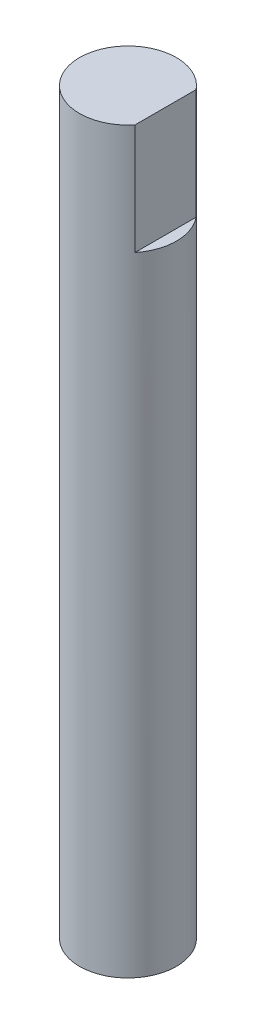
ISO-10303-21;
HEADER;
FILE_DESCRIPTION(('STEP AP214'),'2;1');
FILE_NAME('part.step','',(''),(''),'','','');
FILE_SCHEMA(('AUTOMOTIVE_DESIGN { 1 0 10303 214 1 1 1 1 }'));
ENDSEC;
DATA;
#1=APPLICATION_CONTEXT('core data for automotive mechanical design processes');
#2=APPLICATION_PROTOCOL_DEFINITION('international standard','automotive_design',2000,#1);
#3=PRODUCT_CONTEXT('',#1,'mechanical');
#4=PRODUCT('Part','Part','',(#3));
#5=PRODUCT_RELATED_PRODUCT_CATEGORY('part','',(#4));
#6=PRODUCT_DEFINITION_FORMATION('','',#4);
#7=PRODUCT_DEFINITION_CONTEXT('part definition',#1,'design');
#8=PRODUCT_DEFINITION('design','',#6,#7);
#9=PRODUCT_DEFINITION_SHAPE('','',#8);
#10=(LENGTH_UNIT() NAMED_UNIT(*) SI_UNIT(.MILLI.,.METRE.));
#11=(NAMED_UNIT(*) PLANE_ANGLE_UNIT() SI_UNIT($,.RADIAN.));
#12=(NAMED_UNIT(*) SI_UNIT($,.STERADIAN.) SOLID_ANGLE_UNIT());
#13=UNCERTAINTY_MEASURE_WITH_UNIT(LENGTH_MEASURE(1.E-05),#10,'distance_accuracy_value','');
#14=(GEOMETRIC_REPRESENTATION_CONTEXT(3) GLOBAL_UNCERTAINTY_ASSIGNED_CONTEXT((#13)) GLOBAL_UNIT_ASSIGNED_CONTEXT((#10,
#11,#12)) REPRESENTATION_CONTEXT('',''));
#15=CARTESIAN_POINT('',(0.,0.,0.));
#16=DIRECTION('',(0.,0.,1.));
#17=DIRECTION('',(1.,0.,0.));
#18=AXIS2_PLACEMENT_3D('',#15,#16,#17);
#19=CARTESIAN_POINT('',(0.,38.1,0.));
#20=DIRECTION('',(0.,-1.,0.));
#21=DIRECTION('',(0.,0.,-1.));
#22=AXIS2_PLACEMENT_3D('',#19,#20,#21);
#23=CYLINDRICAL_SURFACE('',#22,2.5);
#24=CARTESIAN_POINT('',(0.,38.1,0.));
#25=DIRECTION('',(0.,1.,0.));
#26=DIRECTION('',(0.,0.,1.));
#27=AXIS2_PLACEMENT_3D('',#24,#25,#26);
#28=CIRCLE('',#27,2.5);
#29=CARTESIAN_POINT('',(1.94,38.1,-1.57683226755416));
#30=VERTEX_POINT('',#29);
#31=CARTESIAN_POINT('',(1.94,38.1,1.57683226755416));
#32=VERTEX_POINT('',#31);
#33=EDGE_CURVE('E11',#30,#32,#28,.T.);
#34=ORIENTED_EDGE('',*,*,#33,.F.);
#35=DIRECTION('',(0.,1.,0.));
#36=VECTOR('',#35,1.);
#37=CARTESIAN_POINT('',(1.94,32.4,-1.57683226755416));
#38=LINE('',#37,#36);
#39=CARTESIAN_POINT('',(1.94,32.4,-1.57683226755416));
#40=VERTEX_POINT('',#39);
#41=EDGE_CURVE('E54',#40,#30,#38,.T.);
#42=ORIENTED_EDGE('',*,*,#41,.F.);
#43=CARTESIAN_POINT('',(0.,32.4,0.));
#44=DIRECTION('',(0.,1.,0.));
#45=DIRECTION('',(0.,0.,1.));
#46=AXIS2_PLACEMENT_3D('',#43,#44,#45);
#47=CIRCLE('',#46,2.5);
#48=CARTESIAN_POINT('',(1.94,32.4,1.57683226755416));
#49=VERTEX_POINT('',#48);
#50=EDGE_CURVE('E70',#49,#40,#47,.T.);
#51=ORIENTED_EDGE('',*,*,#50,.F.);
#52=DIRECTION('',(0.,1.,0.));
#53=VECTOR('',#52,1.);
#54=CARTESIAN_POINT('',(1.94,32.4,1.57683226755416));
#55=LINE('',#54,#53);
#56=EDGE_CURVE('E60',#49,#32,#55,.T.);
#57=ORIENTED_EDGE('',*,*,#56,.T.);
#58=EDGE_LOOP('',(#34,#42,#51,#57));
#59=FACE_BOUND('',#58,.T.);
#60=CARTESIAN_POINT('',(0.,0.,0.));
#61=DIRECTION('',(0.,1.,0.));
#62=DIRECTION('',(0.,0.,1.));
#63=AXIS2_PLACEMENT_3D('',#60,#61,#62);
#64=CIRCLE('',#63,2.5);
#65=CARTESIAN_POINT('',(0.,0.,2.5));
#66=VERTEX_POINT('',#65);
#67=EDGE_CURVE('E42',#66,#66,#64,.T.);
#68=ORIENTED_EDGE('',*,*,#67,.T.);
#69=EDGE_LOOP('',(#68));
#70=FACE_BOUND('',#69,.T.);
#71=ADVANCED_FACE('F39',(#59,#70),#23,.T.);
#72=CARTESIAN_POINT('',(0.,38.1,0.));
#73=DIRECTION('',(0.,1.,0.));
#74=DIRECTION('',(0.,0.,1.));
#75=AXIS2_PLACEMENT_3D('',#72,#73,#74);
#76=PLANE('',#75);
#77=DIRECTION('',(0.,0.,1.));
#78=VECTOR('',#77,1.);
#79=CARTESIAN_POINT('',(1.94,38.1,-1.57683226755416));
#80=LINE('',#79,#78);
#81=EDGE_CURVE('E65',#30,#32,#80,.T.);
#82=ORIENTED_EDGE('',*,*,#81,.F.);
#83=ORIENTED_EDGE('',*,*,#33,.T.);
#84=EDGE_LOOP('',(#82,#83));
#85=FACE_BOUND('',#84,.T.);
#86=ADVANCED_FACE('F77',(#85),#76,.T.);
#87=CARTESIAN_POINT('',(0.,0.,0.));
#88=DIRECTION('',(0.,1.,0.));
#89=DIRECTION('',(0.,0.,1.));
#90=AXIS2_PLACEMENT_3D('',#87,#88,#89);
#91=PLANE('',#90);
#92=ORIENTED_EDGE('',*,*,#67,.F.);
#93=EDGE_LOOP('',(#92));
#94=FACE_BOUND('',#93,.T.);
#95=ADVANCED_FACE('F79',(#94),#91,.F.);
#96=CARTESIAN_POINT('',(1.94,32.4,-1.57683226755416));
#97=DIRECTION('',(-1.,0.,0.));
#98=DIRECTION('',(0.,0.,1.));
#99=AXIS2_PLACEMENT_3D('',#96,#97,#98);
#100=PLANE('',#99);
#101=ORIENTED_EDGE('',*,*,#81,.T.);
#102=ORIENTED_EDGE('',*,*,#56,.F.);
#103=DIRECTION('',(0.,0.,1.));
#104=VECTOR('',#103,1.);
#105=CARTESIAN_POINT('',(1.94,32.4,-1.57683226755416));
#106=LINE('',#105,#104);
#107=EDGE_CURVE('E94',#40,#49,#106,.T.);
#108=ORIENTED_EDGE('',*,*,#107,.F.);
#109=ORIENTED_EDGE('',*,*,#41,.T.);
#110=EDGE_LOOP('',(#101,#102,#108,#109));
#111=FACE_BOUND('',#110,.T.);
#112=ADVANCED_FACE('F66',(#111),#100,.F.);
#113=CARTESIAN_POINT('',(0.,32.4,0.));
#114=DIRECTION('',(0.,1.,0.));
#115=DIRECTION('',(0.,0.,1.));
#116=AXIS2_PLACEMENT_3D('',#113,#114,#115);
#117=PLANE('',#116);
#118=ORIENTED_EDGE('',*,*,#50,.T.);
#119=ORIENTED_EDGE('',*,*,#107,.T.);
#120=EDGE_LOOP('',(#118,#119));
#121=FACE_BOUND('',#120,.T.);
#122=ADVANCED_FACE('F89',(#121),#117,.T.);
#123=CLOSED_SHELL('',(#71,#86,#95,#112,#122));
#124=MANIFOLD_SOLID_BREP('B2',#123);
#125=ADVANCED_BREP_SHAPE_REPRESENTATION('',(#18,#124),#14);
#126=SHAPE_DEFINITION_REPRESENTATION(#9,#125);
ENDSEC;
END-ISO-10303-21;
